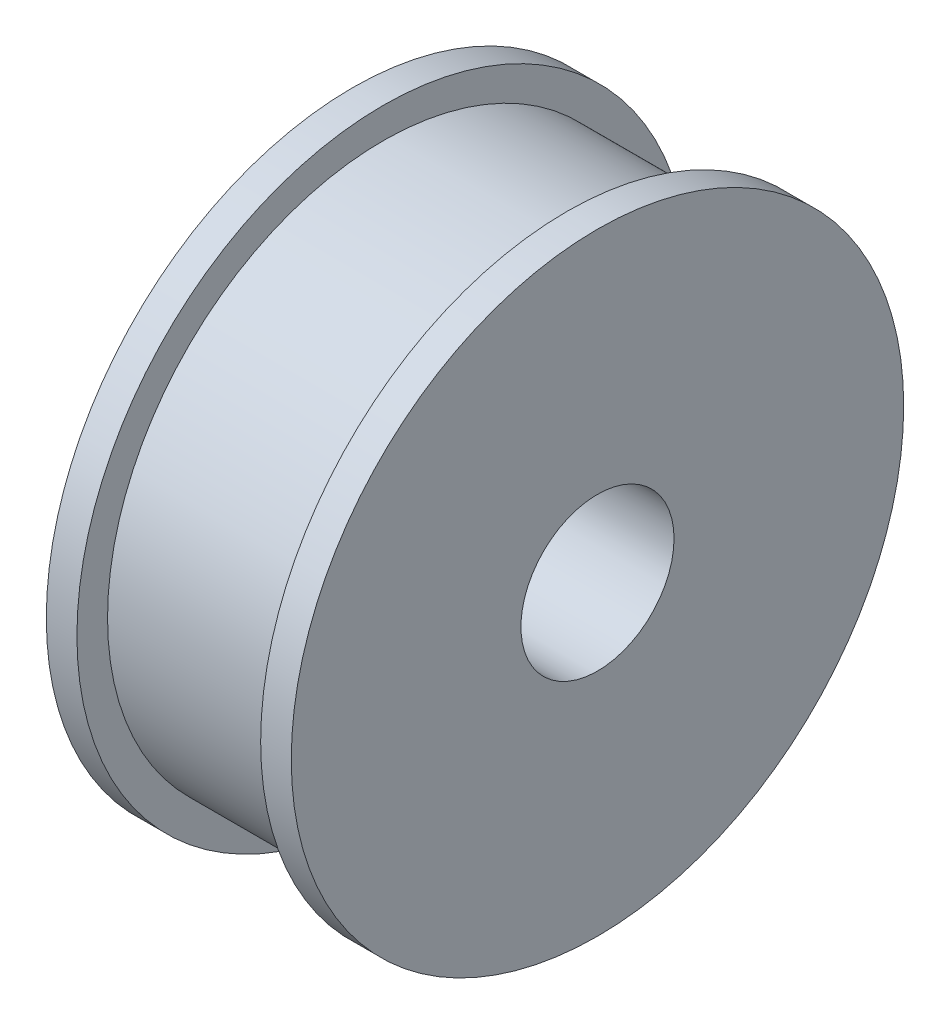
ISO-10303-21;
HEADER;
FILE_DESCRIPTION(('STEP AP214'),'2;1');
FILE_NAME('part.step','',(''),(''),'','','');
FILE_SCHEMA(('AUTOMOTIVE_DESIGN { 1 0 10303 214 1 1 1 1 }'));
ENDSEC;
DATA;
#1=APPLICATION_CONTEXT('core data for automotive mechanical design processes');
#2=APPLICATION_PROTOCOL_DEFINITION('international standard','automotive_design',2000,#1);
#3=PRODUCT_CONTEXT('',#1,'mechanical');
#4=PRODUCT('Part','Part','',(#3));
#5=PRODUCT_RELATED_PRODUCT_CATEGORY('part','',(#4));
#6=PRODUCT_DEFINITION_FORMATION('','',#4);
#7=PRODUCT_DEFINITION_CONTEXT('part definition',#1,'design');
#8=PRODUCT_DEFINITION('design','',#6,#7);
#9=PRODUCT_DEFINITION_SHAPE('','',#8);
#10=(LENGTH_UNIT() NAMED_UNIT(*) SI_UNIT(.MILLI.,.METRE.));
#11=(NAMED_UNIT(*) PLANE_ANGLE_UNIT() SI_UNIT($,.RADIAN.));
#12=(NAMED_UNIT(*) SI_UNIT($,.STERADIAN.) SOLID_ANGLE_UNIT());
#13=UNCERTAINTY_MEASURE_WITH_UNIT(LENGTH_MEASURE(1.E-05),#10,'distance_accuracy_value','');
#14=(GEOMETRIC_REPRESENTATION_CONTEXT(3) GLOBAL_UNCERTAINTY_ASSIGNED_CONTEXT((#13)) GLOBAL_UNIT_ASSIGNED_CONTEXT((#10,
#11,#12)) REPRESENTATION_CONTEXT('',''));
#15=CARTESIAN_POINT('',(0.,0.,0.));
#16=DIRECTION('',(0.,0.,1.));
#17=DIRECTION('',(1.,0.,0.));
#18=AXIS2_PLACEMENT_3D('',#15,#16,#17);
#19=CARTESIAN_POINT('',(5.08,12.7,0.));
#20=DIRECTION('',(-1.,0.,0.));
#21=DIRECTION('',(0.,0.,1.));
#22=AXIS2_PLACEMENT_3D('',#19,#20,#21);
#23=PLANE('',#22);
#24=CARTESIAN_POINT('',(5.08,0.,0.));
#25=DIRECTION('',(1.,0.,0.));
#26=DIRECTION('',(0.,0.,-1.));
#27=AXIS2_PLACEMENT_3D('',#24,#25,#26);
#28=CIRCLE('',#27,3.175);
#29=CARTESIAN_POINT('',(5.08,0.,-3.175));
#30=VERTEX_POINT('',#29);
#31=EDGE_CURVE('E65',#30,#30,#28,.T.);
#32=ORIENTED_EDGE('',*,*,#31,.F.);
#33=EDGE_LOOP('',(#32));
#34=FACE_BOUND('',#33,.T.);
#35=CARTESIAN_POINT('',(5.08,0.,0.));
#36=DIRECTION('',(-1.,0.,0.));
#37=DIRECTION('',(0.,0.,1.));
#38=AXIS2_PLACEMENT_3D('',#35,#36,#37);
#39=CIRCLE('',#38,12.7);
#40=CARTESIAN_POINT('',(5.08,0.,12.7));
#41=VERTEX_POINT('',#40);
#42=EDGE_CURVE('E59',#41,#41,#39,.T.);
#43=ORIENTED_EDGE('',*,*,#42,.F.);
#44=EDGE_LOOP('',(#43));
#45=FACE_BOUND('',#44,.T.);
#46=ADVANCED_FACE('F37',(#34,#45),#23,.F.);
#47=CARTESIAN_POINT('',(-5.08,0.,0.));
#48=DIRECTION('',(1.,0.,0.));
#49=DIRECTION('',(0.,0.,-1.));
#50=AXIS2_PLACEMENT_3D('',#47,#48,#49);
#51=PLANE('',#50);
#52=CARTESIAN_POINT('',(-5.08,0.,0.));
#53=DIRECTION('',(1.,0.,0.));
#54=DIRECTION('',(0.,0.,-1.));
#55=AXIS2_PLACEMENT_3D('',#52,#53,#54);
#56=CIRCLE('',#55,3.175);
#57=CARTESIAN_POINT('',(-5.08,0.,-3.175));
#58=VERTEX_POINT('',#57);
#59=EDGE_CURVE('E62',#58,#58,#56,.F.);
#60=ORIENTED_EDGE('',*,*,#59,.F.);
#61=EDGE_LOOP('',(#60));
#62=FACE_BOUND('',#61,.T.);
#63=CARTESIAN_POINT('',(-5.08,0.,0.));
#64=DIRECTION('',(-1.,0.,0.));
#65=DIRECTION('',(0.,0.,1.));
#66=AXIS2_PLACEMENT_3D('',#63,#64,#65);
#67=CIRCLE('',#66,12.7);
#68=CARTESIAN_POINT('',(-5.08,0.,12.7));
#69=VERTEX_POINT('',#68);
#70=EDGE_CURVE('E10',#69,#69,#67,.T.);
#71=ORIENTED_EDGE('',*,*,#70,.T.);
#72=EDGE_LOOP('',(#71));
#73=FACE_BOUND('',#72,.T.);
#74=ADVANCED_FACE('F74',(#62,#73),#51,.F.);
#75=CARTESIAN_POINT('',(-12.2716232486058,0.,0.));
#76=DIRECTION('',(-1.,0.,0.));
#77=DIRECTION('',(0.,0.,1.));
#78=AXIS2_PLACEMENT_3D('',#75,#76,#77);
#79=CYLINDRICAL_SURFACE('',#78,12.7);
#80=ORIENTED_EDGE('',*,*,#70,.F.);
#81=EDGE_LOOP('',(#80));
#82=FACE_BOUND('',#81,.T.);
#83=CARTESIAN_POINT('',(-3.81,0.,0.));
#84=DIRECTION('',(-1.,0.,0.));
#85=DIRECTION('',(0.,0.,1.));
#86=AXIS2_PLACEMENT_3D('',#83,#84,#85);
#87=CIRCLE('',#86,12.7);
#88=CARTESIAN_POINT('',(-3.81,0.,12.7));
#89=VERTEX_POINT('',#88);
#90=EDGE_CURVE('E43',#89,#89,#87,.T.);
#91=ORIENTED_EDGE('',*,*,#90,.T.);
#92=EDGE_LOOP('',(#91));
#93=FACE_BOUND('',#92,.T.);
#94=ADVANCED_FACE('F98',(#82,#93),#79,.T.);
#95=CARTESIAN_POINT('',(-3.81,12.7,0.));
#96=DIRECTION('',(-1.,0.,0.));
#97=DIRECTION('',(0.,0.,1.));
#98=AXIS2_PLACEMENT_3D('',#95,#96,#97);
#99=PLANE('',#98);
#100=ORIENTED_EDGE('',*,*,#90,.F.);
#101=EDGE_LOOP('',(#100));
#102=FACE_BOUND('',#101,.T.);
#103=CARTESIAN_POINT('',(-3.81,0.,0.));
#104=DIRECTION('',(-1.,0.,0.));
#105=DIRECTION('',(0.,0.,1.));
#106=AXIS2_PLACEMENT_3D('',#103,#104,#105);
#107=CIRCLE('',#106,11.43);
#108=CARTESIAN_POINT('',(-3.81,0.,11.43));
#109=VERTEX_POINT('',#108);
#110=EDGE_CURVE('E47',#109,#109,#107,.T.);
#111=ORIENTED_EDGE('',*,*,#110,.T.);
#112=EDGE_LOOP('',(#111));
#113=FACE_BOUND('',#112,.T.);
#114=ADVANCED_FACE('F94',(#102,#113),#99,.F.);
#115=CARTESIAN_POINT('',(-12.2716232486058,0.,0.));
#116=DIRECTION('',(-1.,0.,0.));
#117=DIRECTION('',(0.,0.,1.));
#118=AXIS2_PLACEMENT_3D('',#115,#116,#117);
#119=CYLINDRICAL_SURFACE('',#118,11.43);
#120=ORIENTED_EDGE('',*,*,#110,.F.);
#121=EDGE_LOOP('',(#120));
#122=FACE_BOUND('',#121,.T.);
#123=CARTESIAN_POINT('',(3.81,0.,0.));
#124=DIRECTION('',(-1.,0.,0.));
#125=DIRECTION('',(0.,0.,1.));
#126=AXIS2_PLACEMENT_3D('',#123,#124,#125);
#127=CIRCLE('',#126,11.43);
#128=CARTESIAN_POINT('',(3.81,0.,11.43));
#129=VERTEX_POINT('',#128);
#130=EDGE_CURVE('E51',#129,#129,#127,.T.);
#131=ORIENTED_EDGE('',*,*,#130,.T.);
#132=EDGE_LOOP('',(#131));
#133=FACE_BOUND('',#132,.T.);
#134=ADVANCED_FACE('F87',(#122,#133),#119,.T.);
#135=CARTESIAN_POINT('',(3.81,11.43,0.));
#136=DIRECTION('',(1.,0.,0.));
#137=DIRECTION('',(0.,0.,-1.));
#138=AXIS2_PLACEMENT_3D('',#135,#136,#137);
#139=PLANE('',#138);
#140=ORIENTED_EDGE('',*,*,#130,.F.);
#141=EDGE_LOOP('',(#140));
#142=FACE_BOUND('',#141,.T.);
#143=CARTESIAN_POINT('',(3.81,0.,0.));
#144=DIRECTION('',(-1.,0.,0.));
#145=DIRECTION('',(0.,0.,1.));
#146=AXIS2_PLACEMENT_3D('',#143,#144,#145);
#147=CIRCLE('',#146,12.7);
#148=CARTESIAN_POINT('',(3.81,0.,12.7));
#149=VERTEX_POINT('',#148);
#150=EDGE_CURVE('E56',#149,#149,#147,.T.);
#151=ORIENTED_EDGE('',*,*,#150,.T.);
#152=EDGE_LOOP('',(#151));
#153=FACE_BOUND('',#152,.T.);
#154=ADVANCED_FACE('F79',(#142,#153),#139,.F.);
#155=CARTESIAN_POINT('',(-12.2716232486058,0.,0.));
#156=DIRECTION('',(-1.,0.,0.));
#157=DIRECTION('',(0.,0.,1.));
#158=AXIS2_PLACEMENT_3D('',#155,#156,#157);
#159=CYLINDRICAL_SURFACE('',#158,12.7);
#160=ORIENTED_EDGE('',*,*,#150,.F.);
#161=EDGE_LOOP('',(#160));
#162=FACE_BOUND('',#161,.T.);
#163=ORIENTED_EDGE('',*,*,#42,.T.);
#164=EDGE_LOOP('',(#163));
#165=FACE_BOUND('',#164,.T.);
#166=ADVANCED_FACE('F77',(#162,#165),#159,.T.);
#167=CARTESIAN_POINT('',(-5.081,0.,0.));
#168=DIRECTION('',(1.,0.,0.));
#169=DIRECTION('',(0.,0.,-1.));
#170=AXIS2_PLACEMENT_3D('',#167,#168,#169);
#171=CYLINDRICAL_SURFACE('',#170,3.175);
#172=CARTESIAN_POINT('',(5.08,0.,-3.175));
#173=CARTESIAN_POINT('',(4.97416666666667,0.,-3.175));
#174=CARTESIAN_POINT('',(4.86833333333333,0.,-3.175));
#175=CARTESIAN_POINT('',(4.65666666666666,0.,-3.175));
#176=CARTESIAN_POINT('',(4.55083333333333,0.,-3.175));
#177=CARTESIAN_POINT('',(4.33916666666666,0.,-3.175));
#178=CARTESIAN_POINT('',(4.23333333333333,0.,-3.175));
#179=CARTESIAN_POINT('',(4.02166666666666,0.,-3.175));
#180=CARTESIAN_POINT('',(3.91583333333333,0.,-3.175));
#181=CARTESIAN_POINT('',(3.70416666666667,0.,-3.175));
#182=CARTESIAN_POINT('',(3.59833333333333,0.,-3.175));
#183=CARTESIAN_POINT('',(3.38666666666666,0.,-3.175));
#184=CARTESIAN_POINT('',(3.28083333333333,0.,-3.175));
#185=CARTESIAN_POINT('',(3.06916666666667,0.,-3.175));
#186=CARTESIAN_POINT('',(2.96333333333333,0.,-3.175));
#187=CARTESIAN_POINT('',(2.75166666666666,0.,-3.175));
#188=CARTESIAN_POINT('',(2.64583333333333,0.,-3.175));
#189=CARTESIAN_POINT('',(2.43416666666667,0.,-3.175));
#190=CARTESIAN_POINT('',(2.32833333333333,0.,-3.175));
#191=CARTESIAN_POINT('',(2.11666666666667,0.,-3.175));
#192=CARTESIAN_POINT('',(2.01083333333333,0.,-3.175));
#193=CARTESIAN_POINT('',(1.79916666666667,0.,-3.175));
#194=CARTESIAN_POINT('',(1.69333333333333,0.,-3.175));
#195=CARTESIAN_POINT('',(1.48166666666667,0.,-3.175));
#196=CARTESIAN_POINT('',(1.37583333333333,0.,-3.175));
#197=CARTESIAN_POINT('',(1.16416666666667,0.,-3.175));
#198=CARTESIAN_POINT('',(1.05833333333333,0.,-3.175));
#199=CARTESIAN_POINT('',(0.846666666666666,0.,-3.175));
#200=CARTESIAN_POINT('',(0.740833333333333,0.,-3.175));
#201=CARTESIAN_POINT('',(0.529166666666666,0.,-3.175));
#202=CARTESIAN_POINT('',(0.423333333333333,0.,-3.175));
#203=CARTESIAN_POINT('',(0.211666666666666,0.,-3.175));
#204=CARTESIAN_POINT('',(0.105833333333332,0.,-3.175));
#205=CARTESIAN_POINT('',(-0.105833333333334,0.,-3.175));
#206=CARTESIAN_POINT('',(-0.211666666666668,0.,-3.175));
#207=CARTESIAN_POINT('',(-0.423333333333334,0.,-3.175));
#208=CARTESIAN_POINT('',(-0.529166666666668,0.,-3.175));
#209=CARTESIAN_POINT('',(-0.740833333333334,0.,-3.175));
#210=CARTESIAN_POINT('',(-0.846666666666668,0.,-3.175));
#211=CARTESIAN_POINT('',(-1.05833333333333,0.,-3.175));
#212=CARTESIAN_POINT('',(-1.16416666666667,0.,-3.175));
#213=CARTESIAN_POINT('',(-1.37583333333333,0.,-3.175));
#214=CARTESIAN_POINT('',(-1.48166666666667,0.,-3.175));
#215=CARTESIAN_POINT('',(-1.69333333333333,0.,-3.175));
#216=CARTESIAN_POINT('',(-1.79916666666667,0.,-3.175));
#217=CARTESIAN_POINT('',(-2.01083333333333,0.,-3.175));
#218=CARTESIAN_POINT('',(-2.11666666666667,0.,-3.175));
#219=CARTESIAN_POINT('',(-2.32833333333333,0.,-3.175));
#220=CARTESIAN_POINT('',(-2.43416666666667,0.,-3.175));
#221=CARTESIAN_POINT('',(-2.64583333333333,0.,-3.175));
#222=CARTESIAN_POINT('',(-2.75166666666667,0.,-3.175));
#223=CARTESIAN_POINT('',(-2.96333333333333,0.,-3.175));
#224=CARTESIAN_POINT('',(-3.06916666666667,0.,-3.175));
#225=CARTESIAN_POINT('',(-3.28083333333333,0.,-3.175));
#226=CARTESIAN_POINT('',(-3.38666666666667,0.,-3.175));
#227=CARTESIAN_POINT('',(-3.59833333333333,0.,-3.175));
#228=CARTESIAN_POINT('',(-3.70416666666667,0.,-3.175));
#229=CARTESIAN_POINT('',(-3.91583333333333,0.,-3.175));
#230=CARTESIAN_POINT('',(-4.02166666666667,0.,-3.175));
#231=CARTESIAN_POINT('',(-4.23333333333333,0.,-3.175));
#232=CARTESIAN_POINT('',(-4.33916666666667,0.,-3.175));
#233=CARTESIAN_POINT('',(-4.55083333333333,0.,-3.175));
#234=CARTESIAN_POINT('',(-4.65666666666667,0.,-3.175));
#235=CARTESIAN_POINT('',(-4.86833333333333,0.,-3.175));
#236=CARTESIAN_POINT('',(-4.97416666666667,0.,-3.175));
#237=CARTESIAN_POINT('',(-5.08,0.,-3.175));
#238=B_SPLINE_CURVE_WITH_KNOTS('',3,(#172,#173,#174,#175,#176,#177,#178,#179,#180,#181,#182,
#183,#184,#185,#186,#187,#188,#189,#190,#191,#192,#193,#194,#195,#196,#197,#198,#199,#200,#201,
#202,#203,#204,#205,#206,#207,#208,#209,#210,#211,#212,#213,#214,#215,#216,#217,#218,#219,#220,
#221,#222,#223,#224,#225,#226,#227,#228,#229,#230,#231,#232,#233,#234,#235,#236,#237),
.UNSPECIFIED.,.F.,.F.,(4,2,2,2,2,2,2,2,2,2,2,2,2,2,2,2,2,2,2,2,2,2,2,2,2,2,2,2,2,2,2,2,4),(0.,
0.3175,0.635,0.9525,1.27,1.5875,1.905,2.2225,2.54,2.8575,3.175,3.4925,3.81,4.1275,4.445,4.7625,
5.08,5.3975,5.715,6.0325,6.35,6.6675,6.985,7.3025,7.62,7.9375,8.255,8.5725,8.89,9.2075,9.525,
9.8425,10.16),.UNSPECIFIED.);
#239=EDGE_CURVE('BSEAM69',#30,#58,#238,.T.);
#240=ORIENTED_EDGE('',*,*,#31,.T.);
#241=ORIENTED_EDGE('',*,*,#59,.T.);
#242=ORIENTED_EDGE('',*,*,#239,.T.);
#243=ORIENTED_EDGE('',*,*,#239,.F.);
#244=EDGE_LOOP('',(#240,#242,#241,#243));
#245=FACE_BOUND('',#244,.T.);
#246=ADVANCED_FACE('F69',(#245),#171,.F.);
#247=CLOSED_SHELL('',(#46,#74,#94,#114,#134,#154,#166,#246));
#248=MANIFOLD_SOLID_BREP('B2',#247);
#249=ADVANCED_BREP_SHAPE_REPRESENTATION('',(#18,#248),#14);
#250=SHAPE_DEFINITION_REPRESENTATION(#9,#249);
ENDSEC;
END-ISO-10303-21;
